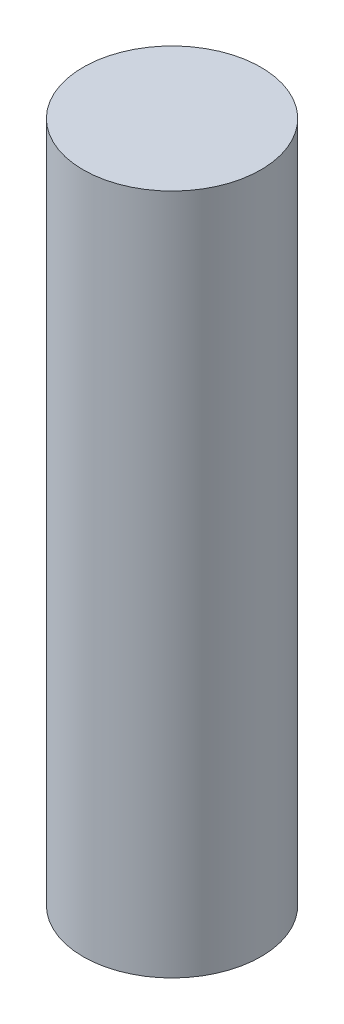
ISO-10303-21;
HEADER;
FILE_DESCRIPTION(('STEP AP214'),'2;1');
FILE_NAME('part.step','',(''),(''),'','','');
FILE_SCHEMA(('AUTOMOTIVE_DESIGN { 1 0 10303 214 1 1 1 1 }'));
ENDSEC;
DATA;
#1=APPLICATION_CONTEXT('core data for automotive mechanical design processes');
#2=APPLICATION_PROTOCOL_DEFINITION('international standard','automotive_design',2000,#1);
#3=PRODUCT_CONTEXT('',#1,'mechanical');
#4=PRODUCT('Part','Part','',(#3));
#5=PRODUCT_RELATED_PRODUCT_CATEGORY('part','',(#4));
#6=PRODUCT_DEFINITION_FORMATION('','',#4);
#7=PRODUCT_DEFINITION_CONTEXT('part definition',#1,'design');
#8=PRODUCT_DEFINITION('design','',#6,#7);
#9=PRODUCT_DEFINITION_SHAPE('','',#8);
#10=(LENGTH_UNIT() NAMED_UNIT(*) SI_UNIT(.MILLI.,.METRE.));
#11=(NAMED_UNIT(*) PLANE_ANGLE_UNIT() SI_UNIT($,.RADIAN.));
#12=(NAMED_UNIT(*) SI_UNIT($,.STERADIAN.) SOLID_ANGLE_UNIT());
#13=UNCERTAINTY_MEASURE_WITH_UNIT(LENGTH_MEASURE(1.E-05),#10,'distance_accuracy_value','');
#14=(GEOMETRIC_REPRESENTATION_CONTEXT(3) GLOBAL_UNCERTAINTY_ASSIGNED_CONTEXT((#13)) GLOBAL_UNIT_ASSIGNED_CONTEXT((#10,
#11,#12)) REPRESENTATION_CONTEXT('',''));
#15=CARTESIAN_POINT('',(0.,0.,0.));
#16=DIRECTION('',(0.,0.,1.));
#17=DIRECTION('',(1.,0.,0.));
#18=AXIS2_PLACEMENT_3D('',#15,#16,#17);
#19=CARTESIAN_POINT('',(0.,11.5,0.));
#20=DIRECTION('',(0.,-1.,0.));
#21=DIRECTION('',(0.,0.,-1.));
#22=AXIS2_PLACEMENT_3D('',#19,#20,#21);
#23=CYLINDRICAL_SURFACE('',#22,1.5);
#24=CARTESIAN_POINT('',(0.,11.5,0.));
#25=DIRECTION('',(0.,1.,0.));
#26=DIRECTION('',(0.,0.,1.));
#27=AXIS2_PLACEMENT_3D('',#24,#25,#26);
#28=CIRCLE('',#27,1.5);
#29=CARTESIAN_POINT('',(0.,11.5,1.5));
#30=VERTEX_POINT('',#29);
#31=EDGE_CURVE('E10',#30,#30,#28,.T.);
#32=ORIENTED_EDGE('',*,*,#31,.F.);
#33=EDGE_LOOP('',(#32));
#34=FACE_BOUND('',#33,.T.);
#35=CARTESIAN_POINT('',(0.,0.,0.));
#36=DIRECTION('',(0.,1.,0.));
#37=DIRECTION('',(0.,0.,1.));
#38=AXIS2_PLACEMENT_3D('',#35,#36,#37);
#39=CIRCLE('',#38,1.5);
#40=CARTESIAN_POINT('',(0.,0.,1.5));
#41=VERTEX_POINT('',#40);
#42=EDGE_CURVE('E34',#41,#41,#39,.T.);
#43=ORIENTED_EDGE('',*,*,#42,.T.);
#44=EDGE_LOOP('',(#43));
#45=FACE_BOUND('',#44,.T.);
#46=ADVANCED_FACE('F31',(#34,#45),#23,.T.);
#47=CARTESIAN_POINT('',(0.,11.5,0.));
#48=DIRECTION('',(0.,1.,0.));
#49=DIRECTION('',(0.,0.,1.));
#50=AXIS2_PLACEMENT_3D('',#47,#48,#49);
#51=PLANE('',#50);
#52=ORIENTED_EDGE('',*,*,#31,.T.);
#53=EDGE_LOOP('',(#52));
#54=FACE_BOUND('',#53,.T.);
#55=ADVANCED_FACE('F46',(#54),#51,.T.);
#56=CARTESIAN_POINT('',(0.,0.,0.));
#57=DIRECTION('',(0.,1.,0.));
#58=DIRECTION('',(0.,0.,1.));
#59=AXIS2_PLACEMENT_3D('',#56,#57,#58);
#60=PLANE('',#59);
#61=ORIENTED_EDGE('',*,*,#42,.F.);
#62=EDGE_LOOP('',(#61));
#63=FACE_BOUND('',#62,.T.);
#64=ADVANCED_FACE('F44',(#63),#60,.F.);
#65=CLOSED_SHELL('',(#46,#55,#64));
#66=MANIFOLD_SOLID_BREP('B2',#65);
#67=ADVANCED_BREP_SHAPE_REPRESENTATION('',(#18,#66),#14);
#68=SHAPE_DEFINITION_REPRESENTATION(#9,#67);
ENDSEC;
END-ISO-10303-21;
